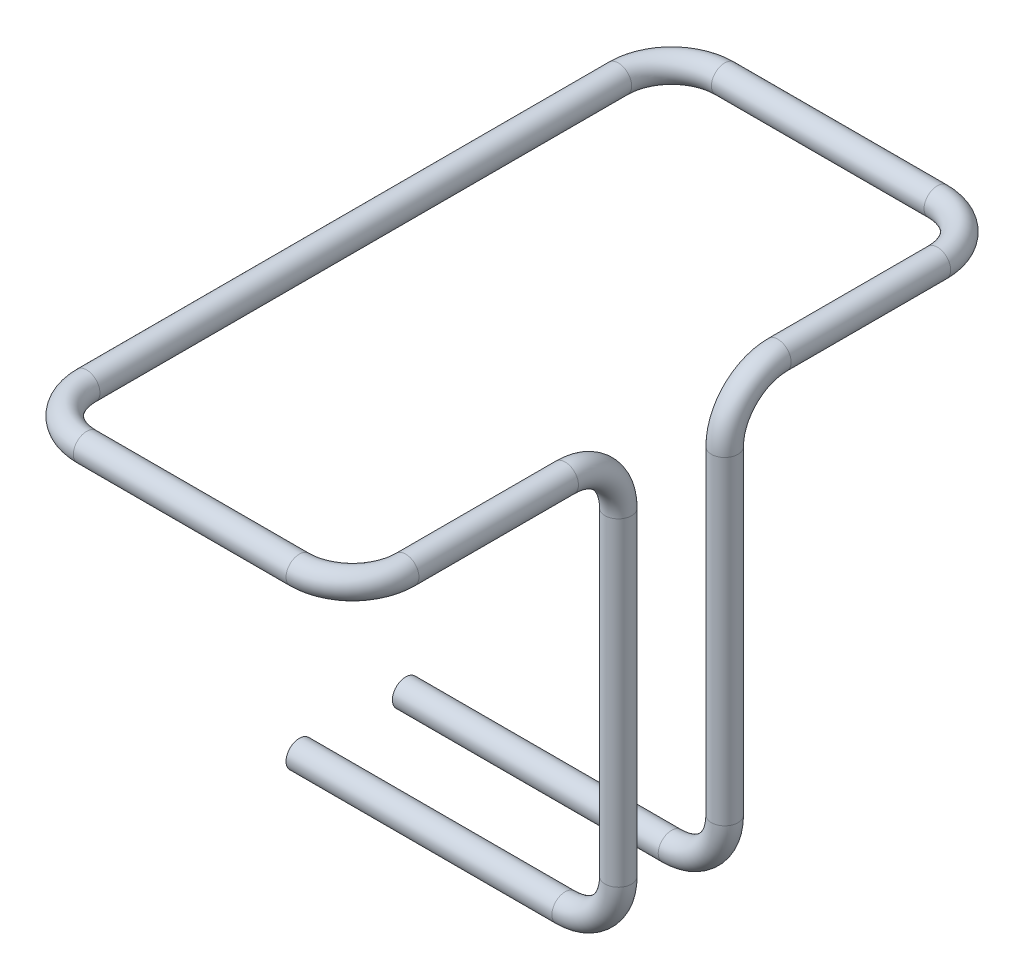
ISO-10303-21;
HEADER;
FILE_DESCRIPTION(('STEP AP214'),'2;1');
FILE_NAME('part.step','',(''),(''),'','','');
FILE_SCHEMA(('AUTOMOTIVE_DESIGN { 1 0 10303 214 1 1 1 1 }'));
ENDSEC;
DATA;
#1=APPLICATION_CONTEXT('core data for automotive mechanical design processes');
#2=APPLICATION_PROTOCOL_DEFINITION('international standard','automotive_design',2000,#1);
#3=PRODUCT_CONTEXT('',#1,'mechanical');
#4=PRODUCT('Part','Part','',(#3));
#5=PRODUCT_RELATED_PRODUCT_CATEGORY('part','',(#4));
#6=PRODUCT_DEFINITION_FORMATION('','',#4);
#7=PRODUCT_DEFINITION_CONTEXT('part definition',#1,'design');
#8=PRODUCT_DEFINITION('design','',#6,#7);
#9=PRODUCT_DEFINITION_SHAPE('','',#8);
#10=(LENGTH_UNIT() NAMED_UNIT(*) SI_UNIT(.MILLI.,.METRE.));
#11=(NAMED_UNIT(*) PLANE_ANGLE_UNIT() SI_UNIT($,.RADIAN.));
#12=(NAMED_UNIT(*) SI_UNIT($,.STERADIAN.) SOLID_ANGLE_UNIT());
#13=UNCERTAINTY_MEASURE_WITH_UNIT(LENGTH_MEASURE(1.E-05),#10,'distance_accuracy_value','');
#14=(GEOMETRIC_REPRESENTATION_CONTEXT(3) GLOBAL_UNCERTAINTY_ASSIGNED_CONTEXT((#13)) GLOBAL_UNIT_ASSIGNED_CONTEXT((#10,
#11,#12)) REPRESENTATION_CONTEXT('',''));
#15=CARTESIAN_POINT('',(0.,0.,0.));
#16=DIRECTION('',(0.,0.,1.));
#17=DIRECTION('',(1.,0.,0.));
#18=AXIS2_PLACEMENT_3D('',#15,#16,#17);
#19=CARTESIAN_POINT('',(-76.2,0.,25.4));
#20=DIRECTION('',(-1.,0.,0.));
#21=DIRECTION('',(0.,0.,1.));
#22=AXIS2_PLACEMENT_3D('',#19,#20,#21);
#23=PLANE('',#22);
#24=CARTESIAN_POINT('',(-76.2,0.,25.4));
#25=DIRECTION('',(-1.,0.,0.));
#26=DIRECTION('',(0.,0.,1.));
#27=AXIS2_PLACEMENT_3D('',#24,#25,#26);
#28=CIRCLE('',#27,3.175);
#29=CARTESIAN_POINT('',(-76.2,0.,28.575));
#30=VERTEX_POINT('',#29);
#31=EDGE_CURVE('E128',#30,#30,#28,.T.);
#32=ORIENTED_EDGE('',*,*,#31,.T.);
#33=EDGE_LOOP('',(#32));
#34=FACE_BOUND('',#33,.T.);
#35=ADVANCED_FACE('F53',(#34),#23,.T.);
#36=CARTESIAN_POINT('',(-76.2,0.,0.));
#37=DIRECTION('',(1.,0.,0.));
#38=DIRECTION('',(0.,0.,-1.));
#39=AXIS2_PLACEMENT_3D('',#36,#37,#38);
#40=PLANE('',#39);
#41=CARTESIAN_POINT('',(-76.2,0.,0.));
#42=DIRECTION('',(1.,0.,0.));
#43=DIRECTION('',(0.,0.,-1.));
#44=AXIS2_PLACEMENT_3D('',#41,#42,#43);
#45=CIRCLE('',#44,3.175);
#46=CARTESIAN_POINT('',(-76.2,0.,-3.175));
#47=VERTEX_POINT('',#46);
#48=EDGE_CURVE('E11',#47,#47,#45,.T.);
#49=ORIENTED_EDGE('',*,*,#48,.F.);
#50=EDGE_LOOP('',(#49));
#51=FACE_BOUND('',#50,.T.);
#52=ADVANCED_FACE('F137',(#51),#40,.F.);
#53=CARTESIAN_POINT('',(-76.2,0.,25.4));
#54=DIRECTION('',(1.,0.,0.));
#55=DIRECTION('',(0.,0.,-1.));
#56=AXIS2_PLACEMENT_3D('',#53,#54,#55);
#57=CYLINDRICAL_SURFACE('',#56,3.175);
#58=CARTESIAN_POINT('',(-12.7,0.,25.4));
#59=DIRECTION('',(-1.,0.,0.));
#60=DIRECTION('',(0.,0.,1.));
#61=AXIS2_PLACEMENT_3D('',#58,#59,#60);
#62=CIRCLE('',#61,3.175);
#63=CARTESIAN_POINT('',(-12.7,-3.175,25.4));
#64=VERTEX_POINT('',#63);
#65=EDGE_CURVE('E124',#64,#64,#62,.T.);
#66=ORIENTED_EDGE('',*,*,#65,.T.);
#67=EDGE_LOOP('',(#66));
#68=FACE_BOUND('',#67,.T.);
#69=ORIENTED_EDGE('',*,*,#31,.F.);
#70=EDGE_LOOP('',(#69));
#71=FACE_BOUND('',#70,.T.);
#72=ADVANCED_FACE('F134',(#68,#71),#57,.T.);
#73=CARTESIAN_POINT('',(-12.7,12.7,25.4));
#74=DIRECTION('',(0.,0.,1.));
#75=DIRECTION('',(1.,0.,0.));
#76=AXIS2_PLACEMENT_3D('',#73,#74,#75);
#77=TOROIDAL_SURFACE('',#76,12.7,3.175);
#78=CARTESIAN_POINT('',(0.,12.7,25.4));
#79=DIRECTION('',(0.,-1.,0.));
#80=DIRECTION('',(0.,0.,1.));
#81=AXIS2_PLACEMENT_3D('',#78,#79,#80);
#82=CIRCLE('',#81,3.175);
#83=CARTESIAN_POINT('',(3.17500000000001,12.7,25.4));
#84=VERTEX_POINT('',#83);
#85=EDGE_CURVE('E120',#84,#84,#82,.T.);
#86=CARTESIAN_POINT('',(-12.7,12.7,25.4));
#87=DIRECTION('',(0.,0.,1.));
#88=DIRECTION('',(1.,0.,0.));
#89=AXIS2_PLACEMENT_3D('',#86,#87,#88);
#90=CIRCLE('',#89,15.875);
#91=EDGE_CURVE('',#64,#84,#90,.T.);
#92=ORIENTED_EDGE('',*,*,#65,.F.);
#93=ORIENTED_EDGE('',*,*,#85,.T.);
#94=ORIENTED_EDGE('',*,*,#91,.T.);
#95=ORIENTED_EDGE('',*,*,#91,.F.);
#96=EDGE_LOOP('',(#92,#94,#93,#95));
#97=FACE_BOUND('',#96,.T.);
#98=ADVANCED_FACE('F136',(#97),#77,.T.);
#99=CARTESIAN_POINT('',(0.,12.7,25.4));
#100=DIRECTION('',(0.,1.,0.));
#101=DIRECTION('',(0.,0.,1.));
#102=AXIS2_PLACEMENT_3D('',#99,#100,#101);
#103=CYLINDRICAL_SURFACE('',#102,3.175);
#104=CARTESIAN_POINT('',(0.,88.9,25.4));
#105=DIRECTION('',(0.,-1.,0.));
#106=DIRECTION('',(0.,0.,1.));
#107=AXIS2_PLACEMENT_3D('',#104,#105,#106);
#108=CIRCLE('',#107,3.175);
#109=CARTESIAN_POINT('',(0.,88.9,22.225));
#110=VERTEX_POINT('',#109);
#111=EDGE_CURVE('E116',#110,#110,#108,.T.);
#112=ORIENTED_EDGE('',*,*,#111,.T.);
#113=EDGE_LOOP('',(#112));
#114=FACE_BOUND('',#113,.T.);
#115=ORIENTED_EDGE('',*,*,#85,.F.);
#116=EDGE_LOOP('',(#115));
#117=FACE_BOUND('',#116,.T.);
#118=ADVANCED_FACE('F144',(#114,#117),#103,.T.);
#119=CARTESIAN_POINT('',(0.,88.9,38.1));
#120=DIRECTION('',(1.,0.,0.));
#121=DIRECTION('',(0.,0.,-1.));
#122=AXIS2_PLACEMENT_3D('',#119,#120,#121);
#123=TOROIDAL_SURFACE('',#122,12.7,3.175);
#124=CARTESIAN_POINT('',(0.,101.6,38.1));
#125=DIRECTION('',(0.,0.,-1.));
#126=DIRECTION('',(0.,-1.,0.));
#127=AXIS2_PLACEMENT_3D('',#124,#125,#126);
#128=CIRCLE('',#127,3.175);
#129=CARTESIAN_POINT('',(0.,104.775,38.1));
#130=VERTEX_POINT('',#129);
#131=EDGE_CURVE('E112',#130,#130,#128,.T.);
#132=CARTESIAN_POINT('',(0.,88.9,38.1));
#133=DIRECTION('',(1.,0.,0.));
#134=DIRECTION('',(0.,0.,-1.));
#135=AXIS2_PLACEMENT_3D('',#132,#133,#134);
#136=CIRCLE('',#135,15.875);
#137=EDGE_CURVE('',#110,#130,#136,.T.);
#138=ORIENTED_EDGE('',*,*,#111,.F.);
#139=ORIENTED_EDGE('',*,*,#131,.T.);
#140=ORIENTED_EDGE('',*,*,#137,.T.);
#141=ORIENTED_EDGE('',*,*,#137,.F.);
#142=EDGE_LOOP('',(#138,#140,#139,#141));
#143=FACE_BOUND('',#142,.T.);
#144=ADVANCED_FACE('F201',(#143),#123,.T.);
#145=CARTESIAN_POINT('',(0.,101.6,38.1));
#146=DIRECTION('',(0.,0.,1.));
#147=DIRECTION('',(1.,0.,0.));
#148=AXIS2_PLACEMENT_3D('',#145,#146,#147);
#149=CYLINDRICAL_SURFACE('',#148,3.175);
#150=CARTESIAN_POINT('',(0.,101.6,76.2));
#151=DIRECTION('',(0.,0.,-1.));
#152=DIRECTION('',(0.,-1.,0.));
#153=AXIS2_PLACEMENT_3D('',#150,#151,#152);
#154=CIRCLE('',#153,3.175);
#155=CARTESIAN_POINT('',(3.17500000000001,101.6,76.2));
#156=VERTEX_POINT('',#155);
#157=EDGE_CURVE('E108',#156,#156,#154,.T.);
#158=ORIENTED_EDGE('',*,*,#157,.T.);
#159=EDGE_LOOP('',(#158));
#160=FACE_BOUND('',#159,.T.);
#161=ORIENTED_EDGE('',*,*,#131,.F.);
#162=EDGE_LOOP('',(#161));
#163=FACE_BOUND('',#162,.T.);
#164=ADVANCED_FACE('F197',(#160,#163),#149,.T.);
#165=CARTESIAN_POINT('',(-12.7,101.6,76.2));
#166=DIRECTION('',(0.,-1.,0.));
#167=DIRECTION('',(0.,0.,-1.));
#168=AXIS2_PLACEMENT_3D('',#165,#166,#167);
#169=TOROIDAL_SURFACE('',#168,12.7,3.175);
#170=CARTESIAN_POINT('',(-12.7,101.6,88.9));
#171=DIRECTION('',(1.,0.,0.));
#172=DIRECTION('',(0.,-1.,0.));
#173=AXIS2_PLACEMENT_3D('',#170,#171,#172);
#174=CIRCLE('',#173,3.175);
#175=CARTESIAN_POINT('',(-12.7,101.6,92.075));
#176=VERTEX_POINT('',#175);
#177=EDGE_CURVE('E104',#176,#176,#174,.T.);
#178=CARTESIAN_POINT('',(-12.7,101.6,76.2));
#179=DIRECTION('',(0.,-1.,0.));
#180=DIRECTION('',(0.,0.,-1.));
#181=AXIS2_PLACEMENT_3D('',#178,#179,#180);
#182=CIRCLE('',#181,15.875);
#183=EDGE_CURVE('',#156,#176,#182,.T.);
#184=ORIENTED_EDGE('',*,*,#157,.F.);
#185=ORIENTED_EDGE('',*,*,#177,.T.);
#186=ORIENTED_EDGE('',*,*,#183,.T.);
#187=ORIENTED_EDGE('',*,*,#183,.F.);
#188=EDGE_LOOP('',(#184,#186,#185,#187));
#189=FACE_BOUND('',#188,.T.);
#190=ADVANCED_FACE('F193',(#189),#169,.T.);
#191=CARTESIAN_POINT('',(-12.7,101.6,88.9));
#192=DIRECTION('',(-1.,0.,0.));
#193=DIRECTION('',(0.,0.,1.));
#194=AXIS2_PLACEMENT_3D('',#191,#192,#193);
#195=CYLINDRICAL_SURFACE('',#194,3.175);
#196=CARTESIAN_POINT('',(-63.5,101.6,88.9));
#197=DIRECTION('',(1.,0.,0.));
#198=DIRECTION('',(0.,-1.,0.));
#199=AXIS2_PLACEMENT_3D('',#196,#197,#198);
#200=CIRCLE('',#199,3.175);
#201=CARTESIAN_POINT('',(-63.5,101.6,92.075));
#202=VERTEX_POINT('',#201);
#203=EDGE_CURVE('E100',#202,#202,#200,.T.);
#204=ORIENTED_EDGE('',*,*,#203,.T.);
#205=EDGE_LOOP('',(#204));
#206=FACE_BOUND('',#205,.T.);
#207=ORIENTED_EDGE('',*,*,#177,.F.);
#208=EDGE_LOOP('',(#207));
#209=FACE_BOUND('',#208,.T.);
#210=ADVANCED_FACE('F189',(#206,#209),#195,.T.);
#211=CARTESIAN_POINT('',(-63.5,101.6,76.2));
#212=DIRECTION('',(0.,-1.,0.));
#213=DIRECTION('',(0.,0.,-1.));
#214=AXIS2_PLACEMENT_3D('',#211,#212,#213);
#215=TOROIDAL_SURFACE('',#214,12.7,3.175);
#216=CARTESIAN_POINT('',(-76.2,101.6,76.2));
#217=DIRECTION('',(0.,0.,1.));
#218=DIRECTION('',(0.,-1.,0.));
#219=AXIS2_PLACEMENT_3D('',#216,#217,#218);
#220=CIRCLE('',#219,3.175);
#221=CARTESIAN_POINT('',(-79.375,101.6,76.2));
#222=VERTEX_POINT('',#221);
#223=EDGE_CURVE('E96',#222,#222,#220,.T.);
#224=CARTESIAN_POINT('',(-63.5,101.6,76.2));
#225=DIRECTION('',(0.,-1.,0.));
#226=DIRECTION('',(0.,0.,-1.));
#227=AXIS2_PLACEMENT_3D('',#224,#225,#226);
#228=CIRCLE('',#227,15.875);
#229=EDGE_CURVE('',#202,#222,#228,.T.);
#230=ORIENTED_EDGE('',*,*,#203,.F.);
#231=ORIENTED_EDGE('',*,*,#223,.T.);
#232=ORIENTED_EDGE('',*,*,#229,.T.);
#233=ORIENTED_EDGE('',*,*,#229,.F.);
#234=EDGE_LOOP('',(#230,#232,#231,#233));
#235=FACE_BOUND('',#234,.T.);
#236=ADVANCED_FACE('F185',(#235),#215,.T.);
#237=CARTESIAN_POINT('',(-76.2,101.6,76.2));
#238=DIRECTION('',(0.,0.,-1.));
#239=DIRECTION('',(-1.,0.,0.));
#240=AXIS2_PLACEMENT_3D('',#237,#238,#239);
#241=CYLINDRICAL_SURFACE('',#240,3.175);
#242=CARTESIAN_POINT('',(-76.2,101.6,-50.8));
#243=DIRECTION('',(0.,0.,1.));
#244=DIRECTION('',(0.,-1.,0.));
#245=AXIS2_PLACEMENT_3D('',#242,#243,#244);
#246=CIRCLE('',#245,3.175);
#247=CARTESIAN_POINT('',(-79.375,101.6,-50.8));
#248=VERTEX_POINT('',#247);
#249=EDGE_CURVE('E92',#248,#248,#246,.T.);
#250=ORIENTED_EDGE('',*,*,#249,.T.);
#251=EDGE_LOOP('',(#250));
#252=FACE_BOUND('',#251,.T.);
#253=ORIENTED_EDGE('',*,*,#223,.F.);
#254=EDGE_LOOP('',(#253));
#255=FACE_BOUND('',#254,.T.);
#256=ADVANCED_FACE('F181',(#252,#255),#241,.T.);
#257=CARTESIAN_POINT('',(-63.5,101.6,-50.8));
#258=DIRECTION('',(0.,-1.,0.));
#259=DIRECTION('',(0.,0.,-1.));
#260=AXIS2_PLACEMENT_3D('',#257,#258,#259);
#261=TOROIDAL_SURFACE('',#260,12.7,3.175);
#262=CARTESIAN_POINT('',(-63.5,101.6,-63.5));
#263=DIRECTION('',(-1.,0.,0.));
#264=DIRECTION('',(0.,-1.,0.));
#265=AXIS2_PLACEMENT_3D('',#262,#263,#264);
#266=CIRCLE('',#265,3.175);
#267=CARTESIAN_POINT('',(-63.5,101.6,-66.675));
#268=VERTEX_POINT('',#267);
#269=EDGE_CURVE('E88',#268,#268,#266,.T.);
#270=CARTESIAN_POINT('',(-63.5,101.6,-50.8));
#271=DIRECTION('',(0.,-1.,0.));
#272=DIRECTION('',(0.,0.,-1.));
#273=AXIS2_PLACEMENT_3D('',#270,#271,#272);
#274=CIRCLE('',#273,15.875);
#275=EDGE_CURVE('',#248,#268,#274,.T.);
#276=ORIENTED_EDGE('',*,*,#249,.F.);
#277=ORIENTED_EDGE('',*,*,#269,.T.);
#278=ORIENTED_EDGE('',*,*,#275,.T.);
#279=ORIENTED_EDGE('',*,*,#275,.F.);
#280=EDGE_LOOP('',(#276,#278,#277,#279));
#281=FACE_BOUND('',#280,.T.);
#282=ADVANCED_FACE('F177',(#281),#261,.T.);
#283=CARTESIAN_POINT('',(-63.5,101.6,-63.5));
#284=DIRECTION('',(1.,0.,0.));
#285=DIRECTION('',(0.,0.,-1.));
#286=AXIS2_PLACEMENT_3D('',#283,#284,#285);
#287=CYLINDRICAL_SURFACE('',#286,3.175);
#288=CARTESIAN_POINT('',(-12.7,101.6,-63.5));
#289=DIRECTION('',(-1.,0.,0.));
#290=DIRECTION('',(0.,-1.,0.));
#291=AXIS2_PLACEMENT_3D('',#288,#289,#290);
#292=CIRCLE('',#291,3.175);
#293=CARTESIAN_POINT('',(-12.7,101.6,-66.675));
#294=VERTEX_POINT('',#293);
#295=EDGE_CURVE('E84',#294,#294,#292,.T.);
#296=ORIENTED_EDGE('',*,*,#295,.T.);
#297=EDGE_LOOP('',(#296));
#298=FACE_BOUND('',#297,.T.);
#299=ORIENTED_EDGE('',*,*,#269,.F.);
#300=EDGE_LOOP('',(#299));
#301=FACE_BOUND('',#300,.T.);
#302=ADVANCED_FACE('F173',(#298,#301),#287,.T.);
#303=CARTESIAN_POINT('',(-12.7,101.6,-50.8));
#304=DIRECTION('',(0.,-1.,0.));
#305=DIRECTION('',(0.,0.,-1.));
#306=AXIS2_PLACEMENT_3D('',#303,#304,#305);
#307=TOROIDAL_SURFACE('',#306,12.7,3.175);
#308=CARTESIAN_POINT('',(0.,101.6,-50.8));
#309=DIRECTION('',(0.,0.,-1.));
#310=DIRECTION('',(0.,-1.,0.));
#311=AXIS2_PLACEMENT_3D('',#308,#309,#310);
#312=CIRCLE('',#311,3.175);
#313=CARTESIAN_POINT('',(3.175,101.6,-50.8));
#314=VERTEX_POINT('',#313);
#315=EDGE_CURVE('E80',#314,#314,#312,.T.);
#316=CARTESIAN_POINT('',(-12.7,101.6,-50.8));
#317=DIRECTION('',(0.,-1.,0.));
#318=DIRECTION('',(0.,0.,-1.));
#319=AXIS2_PLACEMENT_3D('',#316,#317,#318);
#320=CIRCLE('',#319,15.875);
#321=EDGE_CURVE('',#294,#314,#320,.T.);
#322=ORIENTED_EDGE('',*,*,#295,.F.);
#323=ORIENTED_EDGE('',*,*,#315,.T.);
#324=ORIENTED_EDGE('',*,*,#321,.T.);
#325=ORIENTED_EDGE('',*,*,#321,.F.);
#326=EDGE_LOOP('',(#322,#324,#323,#325));
#327=FACE_BOUND('',#326,.T.);
#328=ADVANCED_FACE('F169',(#327),#307,.T.);
#329=CARTESIAN_POINT('',(0.,101.6,-50.8));
#330=DIRECTION('',(0.,0.,1.));
#331=DIRECTION('',(1.,0.,0.));
#332=AXIS2_PLACEMENT_3D('',#329,#330,#331);
#333=CYLINDRICAL_SURFACE('',#332,3.175);
#334=CARTESIAN_POINT('',(0.,101.6,-12.7));
#335=DIRECTION('',(0.,0.,-1.));
#336=DIRECTION('',(0.,-1.,0.));
#337=AXIS2_PLACEMENT_3D('',#334,#335,#336);
#338=CIRCLE('',#337,3.175);
#339=CARTESIAN_POINT('',(0.,104.775,-12.7));
#340=VERTEX_POINT('',#339);
#341=EDGE_CURVE('E76',#340,#340,#338,.T.);
#342=ORIENTED_EDGE('',*,*,#341,.T.);
#343=EDGE_LOOP('',(#342));
#344=FACE_BOUND('',#343,.T.);
#345=ORIENTED_EDGE('',*,*,#315,.F.);
#346=EDGE_LOOP('',(#345));
#347=FACE_BOUND('',#346,.T.);
#348=ADVANCED_FACE('F165',(#344,#347),#333,.T.);
#349=CARTESIAN_POINT('',(0.,88.9,-12.7));
#350=DIRECTION('',(1.,0.,0.));
#351=DIRECTION('',(0.,0.,-1.));
#352=AXIS2_PLACEMENT_3D('',#349,#350,#351);
#353=TOROIDAL_SURFACE('',#352,12.7,3.175);
#354=CARTESIAN_POINT('',(0.,88.9,0.));
#355=DIRECTION('',(0.,1.,0.));
#356=DIRECTION('',(0.,0.,-1.));
#357=AXIS2_PLACEMENT_3D('',#354,#355,#356);
#358=CIRCLE('',#357,3.175);
#359=CARTESIAN_POINT('',(0.,88.9,3.175));
#360=VERTEX_POINT('',#359);
#361=EDGE_CURVE('E70',#360,#360,#358,.T.);
#362=CARTESIAN_POINT('',(0.,88.9,-12.7));
#363=DIRECTION('',(1.,0.,0.));
#364=DIRECTION('',(0.,0.,-1.));
#365=AXIS2_PLACEMENT_3D('',#362,#363,#364);
#366=CIRCLE('',#365,15.875);
#367=EDGE_CURVE('',#340,#360,#366,.T.);
#368=ORIENTED_EDGE('',*,*,#341,.F.);
#369=ORIENTED_EDGE('',*,*,#361,.T.);
#370=ORIENTED_EDGE('',*,*,#367,.T.);
#371=ORIENTED_EDGE('',*,*,#367,.F.);
#372=EDGE_LOOP('',(#368,#370,#369,#371));
#373=FACE_BOUND('',#372,.T.);
#374=ADVANCED_FACE('F161',(#373),#353,.T.);
#375=CARTESIAN_POINT('',(0.,88.9,0.));
#376=DIRECTION('',(0.,-1.,0.));
#377=DIRECTION('',(0.,0.,-1.));
#378=AXIS2_PLACEMENT_3D('',#375,#376,#377);
#379=CYLINDRICAL_SURFACE('',#378,3.175);
#380=CARTESIAN_POINT('',(0.,12.7,0.));
#381=DIRECTION('',(0.,1.,0.));
#382=DIRECTION('',(0.,0.,-1.));
#383=AXIS2_PLACEMENT_3D('',#380,#381,#382);
#384=CIRCLE('',#383,3.175);
#385=CARTESIAN_POINT('',(3.175,12.7,0.));
#386=VERTEX_POINT('',#385);
#387=EDGE_CURVE('E65',#386,#386,#384,.T.);
#388=ORIENTED_EDGE('',*,*,#387,.T.);
#389=EDGE_LOOP('',(#388));
#390=FACE_BOUND('',#389,.T.);
#391=ORIENTED_EDGE('',*,*,#361,.F.);
#392=EDGE_LOOP('',(#391));
#393=FACE_BOUND('',#392,.T.);
#394=ADVANCED_FACE('F155',(#390,#393),#379,.T.);
#395=CARTESIAN_POINT('',(-12.7,12.7,0.));
#396=DIRECTION('',(0.,0.,-1.));
#397=DIRECTION('',(-1.,0.,0.));
#398=AXIS2_PLACEMENT_3D('',#395,#396,#397);
#399=TOROIDAL_SURFACE('',#398,12.7,3.175);
#400=CARTESIAN_POINT('',(-12.7,0.,0.));
#401=DIRECTION('',(1.,0.,0.));
#402=DIRECTION('',(0.,0.,-1.));
#403=AXIS2_PLACEMENT_3D('',#400,#401,#402);
#404=CIRCLE('',#403,3.175);
#405=CARTESIAN_POINT('',(-12.7,-3.175,0.));
#406=VERTEX_POINT('',#405);
#407=EDGE_CURVE('E60',#406,#406,#404,.T.);
#408=CARTESIAN_POINT('',(-12.7,12.7,0.));
#409=DIRECTION('',(0.,0.,-1.));
#410=DIRECTION('',(-1.,0.,0.));
#411=AXIS2_PLACEMENT_3D('',#408,#409,#410);
#412=CIRCLE('',#411,15.875);
#413=EDGE_CURVE('',#386,#406,#412,.T.);
#414=ORIENTED_EDGE('',*,*,#387,.F.);
#415=ORIENTED_EDGE('',*,*,#407,.T.);
#416=ORIENTED_EDGE('',*,*,#413,.T.);
#417=ORIENTED_EDGE('',*,*,#413,.F.);
#418=EDGE_LOOP('',(#414,#416,#415,#417));
#419=FACE_BOUND('',#418,.T.);
#420=ADVANCED_FACE('F150',(#419),#399,.T.);
#421=CARTESIAN_POINT('',(-12.7,0.,0.));
#422=DIRECTION('',(-1.,0.,0.));
#423=DIRECTION('',(0.,0.,1.));
#424=AXIS2_PLACEMENT_3D('',#421,#422,#423);
#425=CYLINDRICAL_SURFACE('',#424,3.175);
#426=ORIENTED_EDGE('',*,*,#48,.T.);
#427=EDGE_LOOP('',(#426));
#428=FACE_BOUND('',#427,.T.);
#429=ORIENTED_EDGE('',*,*,#407,.F.);
#430=EDGE_LOOP('',(#429));
#431=FACE_BOUND('',#430,.T.);
#432=ADVANCED_FACE('F148',(#428,#431),#425,.T.);
#433=CLOSED_SHELL('',(#35,#52,#72,#98,#118,#144,#164,#190,#210,#236,#256,#282,#302,#328,#348,
#374,#394,#420,#432));
#434=MANIFOLD_SOLID_BREP('B2',#433);
#435=ADVANCED_BREP_SHAPE_REPRESENTATION('',(#18,#434),#14);
#436=SHAPE_DEFINITION_REPRESENTATION(#9,#435);
ENDSEC;
END-ISO-10303-21;
